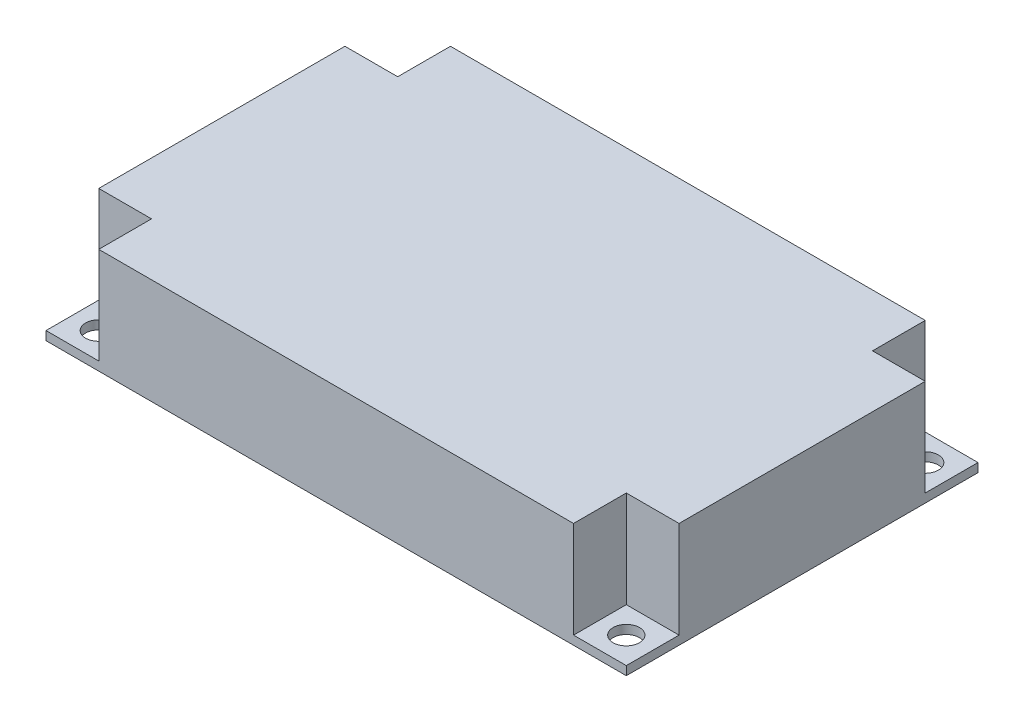
ISO-10303-21;
HEADER;
FILE_DESCRIPTION(('STEP AP214'),'2;1');
FILE_NAME('part.step','',(''),(''),'','','');
FILE_SCHEMA(('AUTOMOTIVE_DESIGN { 1 0 10303 214 1 1 1 1 }'));
ENDSEC;
DATA;
#1=APPLICATION_CONTEXT('core data for automotive mechanical design processes');
#2=APPLICATION_PROTOCOL_DEFINITION('international standard','automotive_design',2000,#1);
#3=PRODUCT_CONTEXT('',#1,'mechanical');
#4=PRODUCT('Part','Part','',(#3));
#5=PRODUCT_RELATED_PRODUCT_CATEGORY('part','',(#4));
#6=PRODUCT_DEFINITION_FORMATION('','',#4);
#7=PRODUCT_DEFINITION_CONTEXT('part definition',#1,'design');
#8=PRODUCT_DEFINITION('design','',#6,#7);
#9=PRODUCT_DEFINITION_SHAPE('','',#8);
#10=(LENGTH_UNIT() NAMED_UNIT(*) SI_UNIT(.MILLI.,.METRE.));
#11=(NAMED_UNIT(*) PLANE_ANGLE_UNIT() SI_UNIT($,.RADIAN.));
#12=(NAMED_UNIT(*) SI_UNIT($,.STERADIAN.) SOLID_ANGLE_UNIT());
#13=UNCERTAINTY_MEASURE_WITH_UNIT(LENGTH_MEASURE(1.E-05),#10,'distance_accuracy_value','');
#14=(GEOMETRIC_REPRESENTATION_CONTEXT(3) GLOBAL_UNCERTAINTY_ASSIGNED_CONTEXT((#13)) GLOBAL_UNIT_ASSIGNED_CONTEXT((#10,
#11,#12)) REPRESENTATION_CONTEXT('',''));
#15=CARTESIAN_POINT('',(0.,0.,0.));
#16=DIRECTION('',(0.,0.,1.));
#17=DIRECTION('',(1.,0.,0.));
#18=AXIS2_PLACEMENT_3D('',#15,#16,#17);
#19=CARTESIAN_POINT('',(30.,0.,17.));
#20=DIRECTION('',(0.,1.,0.));
#21=DIRECTION('',(0.,0.,1.));
#22=AXIS2_PLACEMENT_3D('',#19,#20,#21);
#23=CYLINDRICAL_SURFACE('',#22,1.5);
#24=CARTESIAN_POINT('',(30.,0.,17.));
#25=DIRECTION('',(0.,1.,0.));
#26=DIRECTION('',(0.,0.,-1.));
#27=AXIS2_PLACEMENT_3D('',#24,#25,#26);
#28=CIRCLE('',#27,1.5);
#29=CARTESIAN_POINT('',(30.,0.,15.5));
#30=VERTEX_POINT('',#29);
#31=EDGE_CURVE('E190',#30,#30,#28,.T.);
#32=ORIENTED_EDGE('',*,*,#31,.F.);
#33=EDGE_LOOP('',(#32));
#34=FACE_BOUND('',#33,.T.);
#35=CARTESIAN_POINT('',(30.,1.,17.));
#36=DIRECTION('',(0.,1.,0.));
#37=DIRECTION('',(0.,0.,1.));
#38=AXIS2_PLACEMENT_3D('',#35,#36,#37);
#39=CIRCLE('',#38,1.5);
#40=CARTESIAN_POINT('',(30.,1.,18.5));
#41=VERTEX_POINT('',#40);
#42=EDGE_CURVE('E211',#41,#41,#39,.F.);
#43=ORIENTED_EDGE('',*,*,#42,.F.);
#44=EDGE_LOOP('',(#43));
#45=FACE_BOUND('',#44,.T.);
#46=ADVANCED_FACE('F35',(#34,#45),#23,.F.);
#47=CARTESIAN_POINT('',(-30.,0.,-17.));
#48=DIRECTION('',(0.,1.,0.));
#49=DIRECTION('',(0.,0.,1.));
#50=AXIS2_PLACEMENT_3D('',#47,#48,#49);
#51=CYLINDRICAL_SURFACE('',#50,1.5);
#52=CARTESIAN_POINT('',(-30.,0.,-17.));
#53=DIRECTION('',(0.,1.,0.));
#54=DIRECTION('',(0.,0.,-1.));
#55=AXIS2_PLACEMENT_3D('',#52,#53,#54);
#56=CIRCLE('',#55,1.5);
#57=CARTESIAN_POINT('',(-30.,0.,-18.5));
#58=VERTEX_POINT('',#57);
#59=EDGE_CURVE('E216',#58,#58,#56,.T.);
#60=ORIENTED_EDGE('',*,*,#59,.F.);
#61=EDGE_LOOP('',(#60));
#62=FACE_BOUND('',#61,.T.);
#63=CARTESIAN_POINT('',(-30.,1.,-17.));
#64=DIRECTION('',(0.,1.,0.));
#65=DIRECTION('',(0.,0.,1.));
#66=AXIS2_PLACEMENT_3D('',#63,#64,#65);
#67=CIRCLE('',#66,1.5);
#68=CARTESIAN_POINT('',(-30.,1.,-15.5));
#69=VERTEX_POINT('',#68);
#70=EDGE_CURVE('E205',#69,#69,#67,.F.);
#71=ORIENTED_EDGE('',*,*,#70,.F.);
#72=EDGE_LOOP('',(#71));
#73=FACE_BOUND('',#72,.T.);
#74=ADVANCED_FACE('F314',(#62,#73),#51,.F.);
#75=CARTESIAN_POINT('',(33.,12.,20.));
#76=DIRECTION('',(-1.,0.,0.));
#77=DIRECTION('',(0.,0.,1.));
#78=AXIS2_PLACEMENT_3D('',#75,#76,#77);
#79=PLANE('',#78);
#80=DIRECTION('',(0.,0.,-1.));
#81=VECTOR('',#80,1.);
#82=CARTESIAN_POINT('',(33.,12.,20.));
#83=LINE('',#82,#81);
#84=CARTESIAN_POINT('',(33.,12.,14.));
#85=VERTEX_POINT('',#84);
#86=CARTESIAN_POINT('',(33.,12.,-14.));
#87=VERTEX_POINT('',#86);
#88=EDGE_CURVE('E200',#85,#87,#83,.T.);
#89=ORIENTED_EDGE('',*,*,#88,.F.);
#90=DIRECTION('',(0.,1.,0.));
#91=VECTOR('',#90,1.);
#92=CARTESIAN_POINT('',(33.,1.,14.));
#93=LINE('',#92,#91);
#94=CARTESIAN_POINT('',(33.,1.,14.));
#95=VERTEX_POINT('',#94);
#96=EDGE_CURVE('E259',#95,#85,#93,.T.);
#97=ORIENTED_EDGE('',*,*,#96,.F.);
#98=DIRECTION('',(0.,0.,-1.));
#99=VECTOR('',#98,1.);
#100=CARTESIAN_POINT('',(33.,1.,20.));
#101=LINE('',#100,#99);
#102=CARTESIAN_POINT('',(33.,1.,20.));
#103=VERTEX_POINT('',#102);
#104=EDGE_CURVE('E507',#103,#95,#101,.T.);
#105=ORIENTED_EDGE('',*,*,#104,.F.);
#106=DIRECTION('',(0.,-1.,0.));
#107=VECTOR('',#106,1.);
#108=CARTESIAN_POINT('',(33.,12.,20.));
#109=LINE('',#108,#107);
#110=CARTESIAN_POINT('',(33.,0.,20.));
#111=VERTEX_POINT('',#110);
#112=EDGE_CURVE('E180',#103,#111,#109,.T.);
#113=ORIENTED_EDGE('',*,*,#112,.T.);
#114=DIRECTION('',(0.,0.,-1.));
#115=VECTOR('',#114,1.);
#116=CARTESIAN_POINT('',(33.,0.,20.));
#117=LINE('',#116,#115);
#118=CARTESIAN_POINT('',(33.,0.,-20.));
#119=VERTEX_POINT('',#118);
#120=EDGE_CURVE('E177',#111,#119,#117,.T.);
#121=ORIENTED_EDGE('',*,*,#120,.T.);
#122=DIRECTION('',(0.,-1.,0.));
#123=VECTOR('',#122,1.);
#124=CARTESIAN_POINT('',(33.,12.,-20.));
#125=LINE('',#124,#123);
#126=CARTESIAN_POINT('',(33.,1.,-20.));
#127=VERTEX_POINT('',#126);
#128=EDGE_CURVE('E11',#127,#119,#125,.T.);
#129=ORIENTED_EDGE('',*,*,#128,.F.);
#130=DIRECTION('',(0.,0.,-1.));
#131=VECTOR('',#130,1.);
#132=CARTESIAN_POINT('',(33.,1.,-20.));
#133=LINE('',#132,#131);
#134=CARTESIAN_POINT('',(33.,1.,-14.));
#135=VERTEX_POINT('',#134);
#136=EDGE_CURVE('E152',#135,#127,#133,.T.);
#137=ORIENTED_EDGE('',*,*,#136,.F.);
#138=DIRECTION('',(0.,1.,0.));
#139=VECTOR('',#138,1.);
#140=CARTESIAN_POINT('',(33.,1.,-14.));
#141=LINE('',#140,#139);
#142=EDGE_CURVE('E300',#135,#87,#141,.T.);
#143=ORIENTED_EDGE('',*,*,#142,.T.);
#144=EDGE_LOOP('',(#89,#97,#105,#113,#121,#129,#137,#143));
#145=FACE_BOUND('',#144,.T.);
#146=ADVANCED_FACE('F37',(#145),#79,.F.);
#147=CARTESIAN_POINT('',(-33.,12.,-20.));
#148=DIRECTION('',(0.,0.,1.));
#149=DIRECTION('',(1.,0.,0.));
#150=AXIS2_PLACEMENT_3D('',#147,#148,#149);
#151=PLANE('',#150);
#152=DIRECTION('',(-1.,0.,0.));
#153=VECTOR('',#152,1.);
#154=CARTESIAN_POINT('',(-33.,12.,-20.));
#155=LINE('',#154,#153);
#156=CARTESIAN_POINT('',(27.,12.,-20.));
#157=VERTEX_POINT('',#156);
#158=CARTESIAN_POINT('',(-27.,12.,-20.));
#159=VERTEX_POINT('',#158);
#160=EDGE_CURVE('E230',#157,#159,#155,.T.);
#161=ORIENTED_EDGE('',*,*,#160,.F.);
#162=DIRECTION('',(0.,1.,0.));
#163=VECTOR('',#162,1.);
#164=CARTESIAN_POINT('',(27.,1.,-20.));
#165=LINE('',#164,#163);
#166=CARTESIAN_POINT('',(27.,1.,-20.));
#167=VERTEX_POINT('',#166);
#168=EDGE_CURVE('E171',#167,#157,#165,.T.);
#169=ORIENTED_EDGE('',*,*,#168,.F.);
#170=DIRECTION('',(-1.,0.,0.));
#171=VECTOR('',#170,1.);
#172=CARTESIAN_POINT('',(33.,1.,-20.));
#173=LINE('',#172,#171);
#174=EDGE_CURVE('E157',#127,#167,#173,.T.);
#175=ORIENTED_EDGE('',*,*,#174,.F.);
#176=ORIENTED_EDGE('',*,*,#128,.T.);
#177=DIRECTION('',(-1.,0.,0.));
#178=VECTOR('',#177,1.);
#179=CARTESIAN_POINT('',(-33.,0.,-20.));
#180=LINE('',#179,#178);
#181=CARTESIAN_POINT('',(-33.,0.,-20.));
#182=VERTEX_POINT('',#181);
#183=EDGE_CURVE('E184',#119,#182,#180,.T.);
#184=ORIENTED_EDGE('',*,*,#183,.T.);
#185=DIRECTION('',(0.,-1.,0.));
#186=VECTOR('',#185,1.);
#187=CARTESIAN_POINT('',(-33.,12.,-20.));
#188=LINE('',#187,#186);
#189=CARTESIAN_POINT('',(-33.,1.,-20.));
#190=VERTEX_POINT('',#189);
#191=EDGE_CURVE('E44',#190,#182,#188,.T.);
#192=ORIENTED_EDGE('',*,*,#191,.F.);
#193=DIRECTION('',(-1.,0.,0.));
#194=VECTOR('',#193,1.);
#195=CARTESIAN_POINT('',(-33.,1.,-20.));
#196=LINE('',#195,#194);
#197=CARTESIAN_POINT('',(-27.,1.,-20.));
#198=VERTEX_POINT('',#197);
#199=EDGE_CURVE('E296',#198,#190,#196,.T.);
#200=ORIENTED_EDGE('',*,*,#199,.F.);
#201=DIRECTION('',(0.,1.,0.));
#202=VECTOR('',#201,1.);
#203=CARTESIAN_POINT('',(-27.,1.,-20.));
#204=LINE('',#203,#202);
#205=EDGE_CURVE('E209',#198,#159,#204,.T.);
#206=ORIENTED_EDGE('',*,*,#205,.T.);
#207=EDGE_LOOP('',(#161,#169,#175,#176,#184,#192,#200,#206));
#208=FACE_BOUND('',#207,.T.);
#209=ADVANCED_FACE('F168',(#208),#151,.F.);
#210=CARTESIAN_POINT('',(-33.,12.,20.));
#211=DIRECTION('',(1.,0.,0.));
#212=DIRECTION('',(0.,0.,-1.));
#213=AXIS2_PLACEMENT_3D('',#210,#211,#212);
#214=PLANE('',#213);
#215=DIRECTION('',(0.,0.,1.));
#216=VECTOR('',#215,1.);
#217=CARTESIAN_POINT('',(-33.,1.,20.));
#218=LINE('',#217,#216);
#219=CARTESIAN_POINT('',(-33.,1.,14.));
#220=VERTEX_POINT('',#219);
#221=CARTESIAN_POINT('',(-33.,1.,20.));
#222=VERTEX_POINT('',#221);
#223=EDGE_CURVE('E265',#220,#222,#218,.T.);
#224=ORIENTED_EDGE('',*,*,#223,.F.);
#225=DIRECTION('',(0.,1.,0.));
#226=VECTOR('',#225,1.);
#227=CARTESIAN_POINT('',(-33.,1.,14.));
#228=LINE('',#227,#226);
#229=CARTESIAN_POINT('',(-33.,12.,14.));
#230=VERTEX_POINT('',#229);
#231=EDGE_CURVE('E279',#220,#230,#228,.T.);
#232=ORIENTED_EDGE('',*,*,#231,.T.);
#233=DIRECTION('',(0.,0.,1.));
#234=VECTOR('',#233,1.);
#235=CARTESIAN_POINT('',(-33.,12.,20.));
#236=LINE('',#235,#234);
#237=CARTESIAN_POINT('',(-33.,12.,-14.));
#238=VERTEX_POINT('',#237);
#239=EDGE_CURVE('E232',#238,#230,#236,.T.);
#240=ORIENTED_EDGE('',*,*,#239,.F.);
#241=DIRECTION('',(0.,1.,0.));
#242=VECTOR('',#241,1.);
#243=CARTESIAN_POINT('',(-33.,1.,-14.));
#244=LINE('',#243,#242);
#245=CARTESIAN_POINT('',(-33.,1.,-14.));
#246=VERTEX_POINT('',#245);
#247=EDGE_CURVE('E60',#246,#238,#244,.T.);
#248=ORIENTED_EDGE('',*,*,#247,.F.);
#249=DIRECTION('',(0.,0.,1.));
#250=VECTOR('',#249,1.);
#251=CARTESIAN_POINT('',(-33.,1.,-20.));
#252=LINE('',#251,#250);
#253=EDGE_CURVE('E286',#190,#246,#252,.T.);
#254=ORIENTED_EDGE('',*,*,#253,.F.);
#255=ORIENTED_EDGE('',*,*,#191,.T.);
#256=DIRECTION('',(0.,0.,1.));
#257=VECTOR('',#256,1.);
#258=CARTESIAN_POINT('',(-33.,0.,20.));
#259=LINE('',#258,#257);
#260=CARTESIAN_POINT('',(-33.,0.,20.));
#261=VERTEX_POINT('',#260);
#262=EDGE_CURVE('E187',#182,#261,#259,.T.);
#263=ORIENTED_EDGE('',*,*,#262,.T.);
#264=DIRECTION('',(0.,-1.,0.));
#265=VECTOR('',#264,1.);
#266=CARTESIAN_POINT('',(-33.,12.,20.));
#267=LINE('',#266,#265);
#268=EDGE_CURVE('E202',#222,#261,#267,.T.);
#269=ORIENTED_EDGE('',*,*,#268,.F.);
#270=EDGE_LOOP('',(#224,#232,#240,#248,#254,#255,#263,#269));
#271=FACE_BOUND('',#270,.T.);
#272=ADVANCED_FACE('F339',(#271),#214,.F.);
#273=CARTESIAN_POINT('',(-33.,12.,20.));
#274=DIRECTION('',(0.,0.,-1.));
#275=DIRECTION('',(-1.,0.,0.));
#276=AXIS2_PLACEMENT_3D('',#273,#274,#275);
#277=PLANE('',#276);
#278=DIRECTION('',(1.,0.,0.));
#279=VECTOR('',#278,1.);
#280=CARTESIAN_POINT('',(-33.,12.,20.));
#281=LINE('',#280,#279);
#282=CARTESIAN_POINT('',(-27.,12.,20.));
#283=VERTEX_POINT('',#282);
#284=CARTESIAN_POINT('',(27.,12.,20.));
#285=VERTEX_POINT('',#284);
#286=EDGE_CURVE('E193',#283,#285,#281,.T.);
#287=ORIENTED_EDGE('',*,*,#286,.F.);
#288=DIRECTION('',(0.,1.,0.));
#289=VECTOR('',#288,1.);
#290=CARTESIAN_POINT('',(-27.,1.,20.));
#291=LINE('',#290,#289);
#292=CARTESIAN_POINT('',(-27.,1.,20.));
#293=VERTEX_POINT('',#292);
#294=EDGE_CURVE('E52',#293,#283,#291,.T.);
#295=ORIENTED_EDGE('',*,*,#294,.F.);
#296=DIRECTION('',(1.,0.,0.));
#297=VECTOR('',#296,1.);
#298=CARTESIAN_POINT('',(-33.,1.,20.));
#299=LINE('',#298,#297);
#300=EDGE_CURVE('E267',#222,#293,#299,.T.);
#301=ORIENTED_EDGE('',*,*,#300,.F.);
#302=ORIENTED_EDGE('',*,*,#268,.T.);
#303=DIRECTION('',(1.,0.,0.));
#304=VECTOR('',#303,1.);
#305=CARTESIAN_POINT('',(-33.,0.,20.));
#306=LINE('',#305,#304);
#307=EDGE_CURVE('E198',#261,#111,#306,.T.);
#308=ORIENTED_EDGE('',*,*,#307,.T.);
#309=ORIENTED_EDGE('',*,*,#112,.F.);
#310=DIRECTION('',(1.,0.,0.));
#311=VECTOR('',#310,1.);
#312=CARTESIAN_POINT('',(33.,1.,20.));
#313=LINE('',#312,#311);
#314=CARTESIAN_POINT('',(27.,1.,20.));
#315=VERTEX_POINT('',#314);
#316=EDGE_CURVE('E250',#315,#103,#313,.T.);
#317=ORIENTED_EDGE('',*,*,#316,.F.);
#318=DIRECTION('',(0.,1.,0.));
#319=VECTOR('',#318,1.);
#320=CARTESIAN_POINT('',(27.,1.,20.));
#321=LINE('',#320,#319);
#322=EDGE_CURVE('E249',#315,#285,#321,.T.);
#323=ORIENTED_EDGE('',*,*,#322,.T.);
#324=EDGE_LOOP('',(#287,#295,#301,#302,#308,#309,#317,#323));
#325=FACE_BOUND('',#324,.T.);
#326=ADVANCED_FACE('F246',(#325),#277,.F.);
#327=CARTESIAN_POINT('',(0.,12.,0.));
#328=DIRECTION('',(0.,-1.,0.));
#329=DIRECTION('',(0.,0.,-1.));
#330=AXIS2_PLACEMENT_3D('',#327,#328,#329);
#331=PLANE('',#330);
#332=ORIENTED_EDGE('',*,*,#239,.T.);
#333=DIRECTION('',(-1.,0.,0.));
#334=VECTOR('',#333,1.);
#335=CARTESIAN_POINT('',(-33.,12.,14.));
#336=LINE('',#335,#334);
#337=CARTESIAN_POINT('',(-27.,12.,14.));
#338=VERTEX_POINT('',#337);
#339=EDGE_CURVE('E268',#338,#230,#336,.T.);
#340=ORIENTED_EDGE('',*,*,#339,.F.);
#341=DIRECTION('',(0.,0.,-1.));
#342=VECTOR('',#341,1.);
#343=CARTESIAN_POINT('',(-27.,12.,20.));
#344=LINE('',#343,#342);
#345=EDGE_CURVE('E243',#283,#338,#344,.T.);
#346=ORIENTED_EDGE('',*,*,#345,.F.);
#347=ORIENTED_EDGE('',*,*,#286,.T.);
#348=DIRECTION('',(0.,0.,1.));
#349=VECTOR('',#348,1.);
#350=CARTESIAN_POINT('',(27.,12.,20.));
#351=LINE('',#350,#349);
#352=CARTESIAN_POINT('',(27.,12.,14.));
#353=VERTEX_POINT('',#352);
#354=EDGE_CURVE('E242',#353,#285,#351,.T.);
#355=ORIENTED_EDGE('',*,*,#354,.F.);
#356=DIRECTION('',(-1.,0.,0.));
#357=VECTOR('',#356,1.);
#358=CARTESIAN_POINT('',(33.,12.,14.));
#359=LINE('',#358,#357);
#360=EDGE_CURVE('E282',#85,#353,#359,.T.);
#361=ORIENTED_EDGE('',*,*,#360,.F.);
#362=ORIENTED_EDGE('',*,*,#88,.T.);
#363=DIRECTION('',(1.,0.,0.));
#364=VECTOR('',#363,1.);
#365=CARTESIAN_POINT('',(33.,12.,-14.));
#366=LINE('',#365,#364);
#367=CARTESIAN_POINT('',(27.,12.,-14.));
#368=VERTEX_POINT('',#367);
#369=EDGE_CURVE('E164',#368,#87,#366,.T.);
#370=ORIENTED_EDGE('',*,*,#369,.F.);
#371=DIRECTION('',(0.,0.,1.));
#372=VECTOR('',#371,1.);
#373=CARTESIAN_POINT('',(27.,12.,-20.));
#374=LINE('',#373,#372);
#375=EDGE_CURVE('E254',#157,#368,#374,.T.);
#376=ORIENTED_EDGE('',*,*,#375,.F.);
#377=ORIENTED_EDGE('',*,*,#160,.T.);
#378=DIRECTION('',(0.,0.,-1.));
#379=VECTOR('',#378,1.);
#380=CARTESIAN_POINT('',(-27.,12.,-20.));
#381=LINE('',#380,#379);
#382=CARTESIAN_POINT('',(-27.,12.,-14.));
#383=VERTEX_POINT('',#382);
#384=EDGE_CURVE('E290',#383,#159,#381,.T.);
#385=ORIENTED_EDGE('',*,*,#384,.F.);
#386=DIRECTION('',(1.,0.,0.));
#387=VECTOR('',#386,1.);
#388=CARTESIAN_POINT('',(-33.,12.,-14.));
#389=LINE('',#388,#387);
#390=EDGE_CURVE('E298',#238,#383,#389,.T.);
#391=ORIENTED_EDGE('',*,*,#390,.F.);
#392=EDGE_LOOP('',(#332,#340,#346,#347,#355,#361,#362,#370,#376,#377,#385,#391));
#393=FACE_BOUND('',#392,.T.);
#394=ADVANCED_FACE('F240',(#393),#331,.F.);
#395=CARTESIAN_POINT('',(0.,0.,0.));
#396=DIRECTION('',(0.,-1.,0.));
#397=DIRECTION('',(0.,0.,-1.));
#398=AXIS2_PLACEMENT_3D('',#395,#396,#397);
#399=PLANE('',#398);
#400=ORIENTED_EDGE('',*,*,#59,.T.);
#401=EDGE_LOOP('',(#400));
#402=FACE_BOUND('',#401,.T.);
#403=CARTESIAN_POINT('',(30.,0.,-17.));
#404=DIRECTION('',(0.,1.,0.));
#405=DIRECTION('',(0.,0.,1.));
#406=AXIS2_PLACEMENT_3D('',#403,#404,#405);
#407=CIRCLE('',#406,1.5);
#408=CARTESIAN_POINT('',(30.,0.,-15.5));
#409=VERTEX_POINT('',#408);
#410=EDGE_CURVE('E220',#409,#409,#407,.T.);
#411=ORIENTED_EDGE('',*,*,#410,.T.);
#412=EDGE_LOOP('',(#411));
#413=FACE_BOUND('',#412,.T.);
#414=ORIENTED_EDGE('',*,*,#31,.T.);
#415=EDGE_LOOP('',(#414));
#416=FACE_BOUND('',#415,.T.);
#417=CARTESIAN_POINT('',(-30.,0.,17.));
#418=DIRECTION('',(0.,1.,0.));
#419=DIRECTION('',(0.,0.,1.));
#420=AXIS2_PLACEMENT_3D('',#417,#418,#419);
#421=CIRCLE('',#420,1.5);
#422=CARTESIAN_POINT('',(-30.,0.,18.5));
#423=VERTEX_POINT('',#422);
#424=EDGE_CURVE('E185',#423,#423,#421,.T.);
#425=ORIENTED_EDGE('',*,*,#424,.T.);
#426=EDGE_LOOP('',(#425));
#427=FACE_BOUND('',#426,.T.);
#428=ORIENTED_EDGE('',*,*,#120,.F.);
#429=ORIENTED_EDGE('',*,*,#307,.F.);
#430=ORIENTED_EDGE('',*,*,#262,.F.);
#431=ORIENTED_EDGE('',*,*,#183,.F.);
#432=EDGE_LOOP('',(#428,#429,#430,#431));
#433=FACE_BOUND('',#432,.T.);
#434=ADVANCED_FACE('F309',(#402,#413,#416,#427,#433),#399,.T.);
#435=CARTESIAN_POINT('',(-30.,0.,17.));
#436=DIRECTION('',(0.,1.,0.));
#437=DIRECTION('',(0.,0.,1.));
#438=AXIS2_PLACEMENT_3D('',#435,#436,#437);
#439=CYLINDRICAL_SURFACE('',#438,1.5);
#440=CARTESIAN_POINT('',(-30.,1.,17.));
#441=DIRECTION('',(0.,-1.,0.));
#442=DIRECTION('',(0.,0.,-1.));
#443=AXIS2_PLACEMENT_3D('',#440,#441,#442);
#444=CIRCLE('',#443,1.5);
#445=CARTESIAN_POINT('',(-30.,1.,15.5));
#446=VERTEX_POINT('',#445);
#447=EDGE_CURVE('E39',#446,#446,#444,.F.);
#448=ORIENTED_EDGE('',*,*,#447,.T.);
#449=EDGE_LOOP('',(#448));
#450=FACE_BOUND('',#449,.T.);
#451=ORIENTED_EDGE('',*,*,#424,.F.);
#452=EDGE_LOOP('',(#451));
#453=FACE_BOUND('',#452,.T.);
#454=ADVANCED_FACE('F328',(#450,#453),#439,.F.);
#455=CARTESIAN_POINT('',(30.,0.,-17.));
#456=DIRECTION('',(0.,1.,0.));
#457=DIRECTION('',(0.,0.,1.));
#458=AXIS2_PLACEMENT_3D('',#455,#456,#457);
#459=CYLINDRICAL_SURFACE('',#458,1.5);
#460=CARTESIAN_POINT('',(30.,1.,-17.));
#461=DIRECTION('',(0.,-1.,0.));
#462=DIRECTION('',(0.,0.,-1.));
#463=AXIS2_PLACEMENT_3D('',#460,#461,#462);
#464=CIRCLE('',#463,1.5);
#465=CARTESIAN_POINT('',(30.,1.,-18.5));
#466=VERTEX_POINT('',#465);
#467=EDGE_CURVE('E208',#466,#466,#464,.F.);
#468=ORIENTED_EDGE('',*,*,#467,.T.);
#469=EDGE_LOOP('',(#468));
#470=FACE_BOUND('',#469,.T.);
#471=ORIENTED_EDGE('',*,*,#410,.F.);
#472=EDGE_LOOP('',(#471));
#473=FACE_BOUND('',#472,.T.);
#474=ADVANCED_FACE('F325',(#470,#473),#459,.F.);
#475=CARTESIAN_POINT('',(0.,1.,0.));
#476=DIRECTION('',(0.,1.,0.));
#477=DIRECTION('',(0.,0.,1.));
#478=AXIS2_PLACEMENT_3D('',#475,#476,#477);
#479=PLANE('',#478);
#480=ORIENTED_EDGE('',*,*,#253,.T.);
#481=DIRECTION('',(1.,0.,0.));
#482=VECTOR('',#481,1.);
#483=CARTESIAN_POINT('',(-33.,1.,-14.));
#484=LINE('',#483,#482);
#485=CARTESIAN_POINT('',(-27.,1.,-14.));
#486=VERTEX_POINT('',#485);
#487=EDGE_CURVE('E289',#246,#486,#484,.T.);
#488=ORIENTED_EDGE('',*,*,#487,.T.);
#489=DIRECTION('',(0.,0.,-1.));
#490=VECTOR('',#489,1.);
#491=CARTESIAN_POINT('',(-27.,1.,-20.));
#492=LINE('',#491,#490);
#493=EDGE_CURVE('E293',#486,#198,#492,.T.);
#494=ORIENTED_EDGE('',*,*,#493,.T.);
#495=ORIENTED_EDGE('',*,*,#199,.T.);
#496=EDGE_LOOP('',(#480,#488,#494,#495));
#497=FACE_BOUND('',#496,.T.);
#498=ORIENTED_EDGE('',*,*,#70,.T.);
#499=EDGE_LOOP('',(#498));
#500=FACE_BOUND('',#499,.T.);
#501=ADVANCED_FACE('F327',(#497,#500),#479,.T.);
#502=CARTESIAN_POINT('',(-27.,1.,-20.));
#503=DIRECTION('',(1.,0.,0.));
#504=DIRECTION('',(0.,0.,-1.));
#505=AXIS2_PLACEMENT_3D('',#502,#503,#504);
#506=PLANE('',#505);
#507=ORIENTED_EDGE('',*,*,#384,.T.);
#508=ORIENTED_EDGE('',*,*,#205,.F.);
#509=ORIENTED_EDGE('',*,*,#493,.F.);
#510=DIRECTION('',(0.,1.,0.));
#511=VECTOR('',#510,1.);
#512=CARTESIAN_POINT('',(-27.,1.,-14.));
#513=LINE('',#512,#511);
#514=EDGE_CURVE('E304',#486,#383,#513,.T.);
#515=ORIENTED_EDGE('',*,*,#514,.T.);
#516=EDGE_LOOP('',(#507,#508,#509,#515));
#517=FACE_BOUND('',#516,.T.);
#518=ADVANCED_FACE('F382',(#517),#506,.F.);
#519=CARTESIAN_POINT('',(-33.,1.,-14.));
#520=DIRECTION('',(0.,0.,1.));
#521=DIRECTION('',(1.,0.,0.));
#522=AXIS2_PLACEMENT_3D('',#519,#520,#521);
#523=PLANE('',#522);
#524=ORIENTED_EDGE('',*,*,#390,.T.);
#525=ORIENTED_EDGE('',*,*,#514,.F.);
#526=ORIENTED_EDGE('',*,*,#487,.F.);
#527=ORIENTED_EDGE('',*,*,#247,.T.);
#528=EDGE_LOOP('',(#524,#525,#526,#527));
#529=FACE_BOUND('',#528,.T.);
#530=ADVANCED_FACE('F323',(#529),#523,.F.);
#531=CARTESIAN_POINT('',(0.,1.,0.));
#532=DIRECTION('',(0.,-1.,0.));
#533=DIRECTION('',(0.,0.,-1.));
#534=AXIS2_PLACEMENT_3D('',#531,#532,#533);
#535=PLANE('',#534);
#536=ORIENTED_EDGE('',*,*,#136,.T.);
#537=ORIENTED_EDGE('',*,*,#174,.T.);
#538=DIRECTION('',(0.,0.,1.));
#539=VECTOR('',#538,1.);
#540=CARTESIAN_POINT('',(27.,1.,-20.));
#541=LINE('',#540,#539);
#542=CARTESIAN_POINT('',(27.,1.,-14.));
#543=VERTEX_POINT('',#542);
#544=EDGE_CURVE('E172',#167,#543,#541,.T.);
#545=ORIENTED_EDGE('',*,*,#544,.T.);
#546=DIRECTION('',(1.,0.,0.));
#547=VECTOR('',#546,1.);
#548=CARTESIAN_POINT('',(33.,1.,-14.));
#549=LINE('',#548,#547);
#550=EDGE_CURVE('E160',#543,#135,#549,.T.);
#551=ORIENTED_EDGE('',*,*,#550,.T.);
#552=EDGE_LOOP('',(#536,#537,#545,#551));
#553=FACE_BOUND('',#552,.T.);
#554=ORIENTED_EDGE('',*,*,#467,.F.);
#555=EDGE_LOOP('',(#554));
#556=FACE_BOUND('',#555,.T.);
#557=ADVANCED_FACE('F154',(#553,#556),#535,.F.);
#558=CARTESIAN_POINT('',(33.,1.,-14.));
#559=DIRECTION('',(0.,0.,1.));
#560=DIRECTION('',(1.,0.,0.));
#561=AXIS2_PLACEMENT_3D('',#558,#559,#560);
#562=PLANE('',#561);
#563=ORIENTED_EDGE('',*,*,#369,.T.);
#564=ORIENTED_EDGE('',*,*,#142,.F.);
#565=ORIENTED_EDGE('',*,*,#550,.F.);
#566=DIRECTION('',(0.,1.,0.));
#567=VECTOR('',#566,1.);
#568=CARTESIAN_POINT('',(27.,1.,-14.));
#569=LINE('',#568,#567);
#570=EDGE_CURVE('E501',#543,#368,#569,.T.);
#571=ORIENTED_EDGE('',*,*,#570,.T.);
#572=EDGE_LOOP('',(#563,#564,#565,#571));
#573=FACE_BOUND('',#572,.T.);
#574=ADVANCED_FACE('F400',(#573),#562,.F.);
#575=CARTESIAN_POINT('',(27.,1.,-20.));
#576=DIRECTION('',(-1.,0.,0.));
#577=DIRECTION('',(0.,0.,1.));
#578=AXIS2_PLACEMENT_3D('',#575,#576,#577);
#579=PLANE('',#578);
#580=ORIENTED_EDGE('',*,*,#375,.T.);
#581=ORIENTED_EDGE('',*,*,#570,.F.);
#582=ORIENTED_EDGE('',*,*,#544,.F.);
#583=ORIENTED_EDGE('',*,*,#168,.T.);
#584=EDGE_LOOP('',(#580,#581,#582,#583));
#585=FACE_BOUND('',#584,.T.);
#586=ADVANCED_FACE('F407',(#585),#579,.F.);
#587=CARTESIAN_POINT('',(0.,1.,0.));
#588=DIRECTION('',(0.,1.,0.));
#589=DIRECTION('',(0.,0.,1.));
#590=AXIS2_PLACEMENT_3D('',#587,#588,#589);
#591=PLANE('',#590);
#592=ORIENTED_EDGE('',*,*,#104,.T.);
#593=DIRECTION('',(-1.,0.,0.));
#594=VECTOR('',#593,1.);
#595=CARTESIAN_POINT('',(33.,1.,14.));
#596=LINE('',#595,#594);
#597=CARTESIAN_POINT('',(27.,1.,14.));
#598=VERTEX_POINT('',#597);
#599=EDGE_CURVE('E510',#95,#598,#596,.T.);
#600=ORIENTED_EDGE('',*,*,#599,.T.);
#601=DIRECTION('',(0.,0.,1.));
#602=VECTOR('',#601,1.);
#603=CARTESIAN_POINT('',(27.,1.,20.));
#604=LINE('',#603,#602);
#605=EDGE_CURVE('E513',#598,#315,#604,.T.);
#606=ORIENTED_EDGE('',*,*,#605,.T.);
#607=ORIENTED_EDGE('',*,*,#316,.T.);
#608=EDGE_LOOP('',(#592,#600,#606,#607));
#609=FACE_BOUND('',#608,.T.);
#610=ORIENTED_EDGE('',*,*,#42,.T.);
#611=EDGE_LOOP('',(#610));
#612=FACE_BOUND('',#611,.T.);
#613=ADVANCED_FACE('F415',(#609,#612),#591,.T.);
#614=CARTESIAN_POINT('',(27.,1.,20.));
#615=DIRECTION('',(-1.,0.,0.));
#616=DIRECTION('',(0.,0.,1.));
#617=AXIS2_PLACEMENT_3D('',#614,#615,#616);
#618=PLANE('',#617);
#619=ORIENTED_EDGE('',*,*,#354,.T.);
#620=ORIENTED_EDGE('',*,*,#322,.F.);
#621=ORIENTED_EDGE('',*,*,#605,.F.);
#622=DIRECTION('',(0.,1.,0.));
#623=VECTOR('',#622,1.);
#624=CARTESIAN_POINT('',(27.,1.,14.));
#625=LINE('',#624,#623);
#626=EDGE_CURVE('E255',#598,#353,#625,.T.);
#627=ORIENTED_EDGE('',*,*,#626,.T.);
#628=EDGE_LOOP('',(#619,#620,#621,#627));
#629=FACE_BOUND('',#628,.T.);
#630=ADVANCED_FACE('F423',(#629),#618,.F.);
#631=CARTESIAN_POINT('',(33.,1.,14.));
#632=DIRECTION('',(0.,0.,-1.));
#633=DIRECTION('',(-1.,0.,0.));
#634=AXIS2_PLACEMENT_3D('',#631,#632,#633);
#635=PLANE('',#634);
#636=ORIENTED_EDGE('',*,*,#360,.T.);
#637=ORIENTED_EDGE('',*,*,#626,.F.);
#638=ORIENTED_EDGE('',*,*,#599,.F.);
#639=ORIENTED_EDGE('',*,*,#96,.T.);
#640=EDGE_LOOP('',(#636,#637,#638,#639));
#641=FACE_BOUND('',#640,.T.);
#642=ADVANCED_FACE('F431',(#641),#635,.F.);
#643=CARTESIAN_POINT('',(0.,1.,0.));
#644=DIRECTION('',(0.,-1.,0.));
#645=DIRECTION('',(0.,0.,-1.));
#646=AXIS2_PLACEMENT_3D('',#643,#644,#645);
#647=PLANE('',#646);
#648=ORIENTED_EDGE('',*,*,#223,.T.);
#649=ORIENTED_EDGE('',*,*,#300,.T.);
#650=DIRECTION('',(0.,0.,-1.));
#651=VECTOR('',#650,1.);
#652=CARTESIAN_POINT('',(-27.,1.,20.));
#653=LINE('',#652,#651);
#654=CARTESIAN_POINT('',(-27.,1.,14.));
#655=VERTEX_POINT('',#654);
#656=EDGE_CURVE('E271',#293,#655,#653,.T.);
#657=ORIENTED_EDGE('',*,*,#656,.T.);
#658=DIRECTION('',(-1.,0.,0.));
#659=VECTOR('',#658,1.);
#660=CARTESIAN_POINT('',(-33.,1.,14.));
#661=LINE('',#660,#659);
#662=EDGE_CURVE('E274',#655,#220,#661,.T.);
#663=ORIENTED_EDGE('',*,*,#662,.T.);
#664=EDGE_LOOP('',(#648,#649,#657,#663));
#665=FACE_BOUND('',#664,.T.);
#666=ORIENTED_EDGE('',*,*,#447,.F.);
#667=EDGE_LOOP('',(#666));
#668=FACE_BOUND('',#667,.T.);
#669=ADVANCED_FACE('F438',(#665,#668),#647,.F.);
#670=CARTESIAN_POINT('',(-33.,1.,14.));
#671=DIRECTION('',(0.,0.,-1.));
#672=DIRECTION('',(-1.,0.,0.));
#673=AXIS2_PLACEMENT_3D('',#670,#671,#672);
#674=PLANE('',#673);
#675=ORIENTED_EDGE('',*,*,#339,.T.);
#676=ORIENTED_EDGE('',*,*,#231,.F.);
#677=ORIENTED_EDGE('',*,*,#662,.F.);
#678=DIRECTION('',(0.,1.,0.));
#679=VECTOR('',#678,1.);
#680=CARTESIAN_POINT('',(-27.,1.,14.));
#681=LINE('',#680,#679);
#682=EDGE_CURVE('E283',#655,#338,#681,.T.);
#683=ORIENTED_EDGE('',*,*,#682,.T.);
#684=EDGE_LOOP('',(#675,#676,#677,#683));
#685=FACE_BOUND('',#684,.T.);
#686=ADVANCED_FACE('F446',(#685),#674,.F.);
#687=CARTESIAN_POINT('',(-27.,1.,20.));
#688=DIRECTION('',(1.,0.,0.));
#689=DIRECTION('',(0.,0.,-1.));
#690=AXIS2_PLACEMENT_3D('',#687,#688,#689);
#691=PLANE('',#690);
#692=ORIENTED_EDGE('',*,*,#345,.T.);
#693=ORIENTED_EDGE('',*,*,#682,.F.);
#694=ORIENTED_EDGE('',*,*,#656,.F.);
#695=ORIENTED_EDGE('',*,*,#294,.T.);
#696=EDGE_LOOP('',(#692,#693,#694,#695));
#697=FACE_BOUND('',#696,.T.);
#698=ADVANCED_FACE('F454',(#697),#691,.F.);
#699=CLOSED_SHELL('',(#46,#74,#146,#209,#272,#326,#394,#434,#454,#474,#501,#518,#530,#557,#574,
#586,#613,#630,#642,#669,#686,#698));
#700=MANIFOLD_SOLID_BREP('B2',#699);
#701=ADVANCED_BREP_SHAPE_REPRESENTATION('',(#18,#700),#14);
#702=SHAPE_DEFINITION_REPRESENTATION(#9,#701);
ENDSEC;
END-ISO-10303-21;
